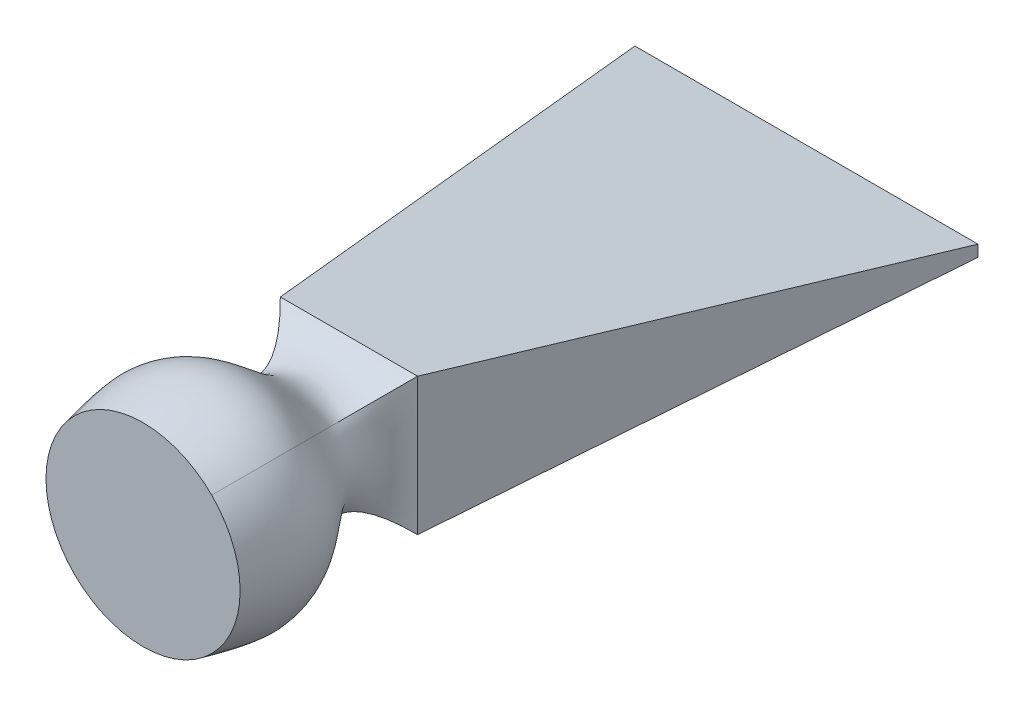
ISO-10303-21;
HEADER;
FILE_DESCRIPTION(('STEP AP214'),'2;1');
FILE_NAME('part.step','',(''),(''),'','','');
FILE_SCHEMA(('AUTOMOTIVE_DESIGN { 1 0 10303 214 1 1 1 1 }'));
ENDSEC;
DATA;
#1=APPLICATION_CONTEXT('core data for automotive mechanical design processes');
#2=APPLICATION_PROTOCOL_DEFINITION('international standard','automotive_design',2000,#1);
#3=PRODUCT_CONTEXT('',#1,'mechanical');
#4=PRODUCT('Part','Part','',(#3));
#5=PRODUCT_RELATED_PRODUCT_CATEGORY('part','',(#4));
#6=PRODUCT_DEFINITION_FORMATION('','',#4);
#7=PRODUCT_DEFINITION_CONTEXT('part definition',#1,'design');
#8=PRODUCT_DEFINITION('design','',#6,#7);
#9=PRODUCT_DEFINITION_SHAPE('','',#8);
#10=(LENGTH_UNIT() NAMED_UNIT(*) SI_UNIT(.MILLI.,.METRE.));
#11=(NAMED_UNIT(*) PLANE_ANGLE_UNIT() SI_UNIT($,.RADIAN.));
#12=(NAMED_UNIT(*) SI_UNIT($,.STERADIAN.) SOLID_ANGLE_UNIT());
#13=UNCERTAINTY_MEASURE_WITH_UNIT(LENGTH_MEASURE(1.E-05),#10,'distance_accuracy_value','');
#14=(GEOMETRIC_REPRESENTATION_CONTEXT(3) GLOBAL_UNCERTAINTY_ASSIGNED_CONTEXT((#13)) GLOBAL_UNIT_ASSIGNED_CONTEXT((#10,
#11,#12)) REPRESENTATION_CONTEXT('',''));
#15=CARTESIAN_POINT('',(0.,0.,0.));
#16=DIRECTION('',(0.,0.,1.));
#17=DIRECTION('',(1.,0.,0.));
#18=AXIS2_PLACEMENT_3D('',#15,#16,#17);
#19=CARTESIAN_POINT('',(0.,0.,90.));
#20=DIRECTION('',(0.,0.,1.));
#21=DIRECTION('',(1.,0.,0.));
#22=AXIS2_PLACEMENT_3D('',#19,#20,#21);
#23=PLANE('',#22);
#24=CARTESIAN_POINT('',(0.,0.,90.));
#25=DIRECTION('',(0.,0.,1.));
#26=DIRECTION('',(1.,0.,0.));
#27=AXIS2_PLACEMENT_3D('',#24,#25,#26);
#28=CIRCLE('',#27,42.4264068711928);
#29=CARTESIAN_POINT('',(-30.,30.,90.));
#30=VERTEX_POINT('',#29);
#31=CARTESIAN_POINT('',(-30.,-30.,90.));
#32=VERTEX_POINT('',#31);
#33=EDGE_CURVE('E12',#30,#32,#28,.T.);
#34=ORIENTED_EDGE('',*,*,#33,.T.);
#35=CARTESIAN_POINT('',(30.,-30.,90.));
#36=VERTEX_POINT('',#35);
#37=EDGE_CURVE('E91',#32,#36,#28,.T.);
#38=ORIENTED_EDGE('',*,*,#37,.T.);
#39=CARTESIAN_POINT('',(30.,30.,90.));
#40=VERTEX_POINT('',#39);
#41=EDGE_CURVE('E437',#36,#40,#28,.T.);
#42=ORIENTED_EDGE('',*,*,#41,.T.);
#43=EDGE_CURVE('E376',#40,#30,#28,.T.);
#44=ORIENTED_EDGE('',*,*,#43,.T.);
#45=EDGE_LOOP('',(#34,#38,#42,#44));
#46=FACE_BOUND('',#45,.T.);
#47=ADVANCED_FACE('F85',(#46),#23,.T.);
#48=CARTESIAN_POINT('',(-30.,-30.,0.));
#49=CARTESIAN_POINT('',(-21.5118114248613,-21.5118114248613,8.33333333333333));
#50=CARTESIAN_POINT('',(-10.829816914607,-10.829816914607,26.6793114807311));
#51=CARTESIAN_POINT('',(-36.8093660734544,-36.8093660734544,50.9737526603883));
#52=CARTESIAN_POINT('',(-32.4256114599819,-32.4256114599819,75.7164029367123));
#53=CARTESIAN_POINT('',(-30.,-30.,90.));
#54=CARTESIAN_POINT('',(-10.,-30.,0.));
#55=CARTESIAN_POINT('',(-6.9884027450108,-21.5118114248613,8.33333333333333));
#56=CARTESIAN_POINT('',(-5.75176294849771,-23.1119802716853,26.6808062151397));
#57=CARTESIAN_POINT('',(-16.2115756696794,-55.057962976394,50.9672478116266));
#58=CARTESIAN_POINT('',(-14.299778198001,-48.986669058954,75.7348186902476));
#59=CARTESIAN_POINT('',(-13.442549702307,-46.557450297693,90.));
#60=CARTESIAN_POINT('',(10.,-30.,0.));
#61=CARTESIAN_POINT('',(7.53500593483973,-21.5118114248613,8.33333333333333));
#62=CARTESIAN_POINT('',(6.98706289419131,-23.1122730621668,26.6823009495483));
#63=CARTESIAN_POINT('',(15.7695051189354,-55.0566887983261,50.9607429628648));
#64=CARTESIAN_POINT('',(14.1537041709008,-48.9902763602331,75.753234443783));
#65=CARTESIAN_POINT('',(13.442549702307,-46.557450297693,90.));
#66=CARTESIAN_POINT('',(30.,-30.,0.));
#67=CARTESIAN_POINT('',(22.0584146146903,-21.5118114248613,8.33333333333333));
#68=CARTESIAN_POINT('',(12.0651168603006,-10.8306952860514,26.6837956839569));
#69=CARTESIAN_POINT('',(36.3672955227104,-36.8055435392507,50.9542381141031));
#70=CARTESIAN_POINT('',(32.2795374328817,-32.4364333638192,75.7716501973183));
#71=CARTESIAN_POINT('',(30.,-30.,90.));
#72=B_SPLINE_SURFACE_WITH_KNOTS('',3,3,((#48,#49,#50,#51,#52,#53),(#54,#55,#56,#57,#58,#59),
(#60,#61,#62,#63,#64,#65),(#66,#67,#68,#69,#70,#71)),.UNSPECIFIED.,.F.,.F.,.F.,(4,4),(4,1,1,4),
(0.,1.),(0.,0.284253833180905,0.593781069386952,1.),.UNSPECIFIED.);
#73=DIRECTION('',(1.,0.,0.));
#74=VECTOR('',#73,1.);
#75=CARTESIAN_POINT('',(-30.,-30.,0.));
#76=LINE('',#75,#74);
#77=CARTESIAN_POINT('',(-30.,-30.,0.));
#78=VERTEX_POINT('',#77);
#79=CARTESIAN_POINT('',(30.,-30.,0.));
#80=VERTEX_POINT('',#79);
#81=EDGE_CURVE('E418',#78,#80,#76,.T.);
#82=CARTESIAN_POINT('',(30.,-30.,0.));
#83=CARTESIAN_POINT('',(22.0584146146903,-21.5118114248613,8.33333333333333));
#84=CARTESIAN_POINT('',(12.0651168603006,-10.8306952860514,26.6837956839569));
#85=CARTESIAN_POINT('',(36.3672955227104,-36.8055435392507,50.9542381141031));
#86=CARTESIAN_POINT('',(32.2795374328817,-32.4364333638192,75.7716501973183));
#87=CARTESIAN_POINT('',(30.,-30.,90.));
#88=B_SPLINE_CURVE_WITH_KNOTS('',3,(#82,#83,#84,#85,#86,#87),.UNSPECIFIED.,.F.,.F.,(4,1,1,4),
(0.,0.284253833180905,0.593781069386952,1.),.UNSPECIFIED.);
#89=EDGE_CURVE('E400',#80,#36,#88,.T.);
#90=CARTESIAN_POINT('',(-30.,-30.,0.));
#91=CARTESIAN_POINT('',(-21.5118114248613,-21.5118114248613,8.33333333333333));
#92=CARTESIAN_POINT('',(-10.829816914607,-10.829816914607,26.6793114807311));
#93=CARTESIAN_POINT('',(-36.8093660734544,-36.8093660734544,50.9737526603883));
#94=CARTESIAN_POINT('',(-32.4256114599819,-32.4256114599819,75.7164029367123));
#95=CARTESIAN_POINT('',(-30.,-30.,90.));
#96=B_SPLINE_CURVE_WITH_KNOTS('',3,(#90,#91,#92,#93,#94,#95),.UNSPECIFIED.,.F.,.F.,(4,1,1,4),
(0.,0.284253833180905,0.593781069386952,1.),.UNSPECIFIED.);
#97=EDGE_CURVE('E251',#32,#78,#96,.F.);
#98=ORIENTED_EDGE('',*,*,#81,.T.);
#99=ORIENTED_EDGE('',*,*,#89,.T.);
#100=ORIENTED_EDGE('',*,*,#37,.F.);
#101=ORIENTED_EDGE('',*,*,#97,.T.);
#102=EDGE_LOOP('',(#98,#99,#100,#101));
#103=FACE_BOUND('',#102,.T.);
#104=ADVANCED_FACE('F298',(#103),#72,.T.);
#105=CARTESIAN_POINT('',(30.,-30.,0.));
#106=CARTESIAN_POINT('',(22.0584146146903,-21.5118114248613,8.33333333333333));
#107=CARTESIAN_POINT('',(12.0651168603006,-10.8306952860514,26.6837956839569));
#108=CARTESIAN_POINT('',(36.3672955227104,-36.8055435392507,50.9542381141031));
#109=CARTESIAN_POINT('',(32.2795374328817,-32.4364333638192,75.7716501973183));
#110=CARTESIAN_POINT('',(30.,-30.,90.));
#111=CARTESIAN_POINT('',(30.,-10.,0.));
#112=CARTESIAN_POINT('',(22.0584146146903,-6.9884027450108,8.33333333333333));
#113=CARTESIAN_POINT('',(24.3472638182131,-5.75207213814497,26.6853038157003));
#114=CARTESIAN_POINT('',(54.6159637922371,-16.2102301250244,50.9476749622502));
#115=CARTESIAN_POINT('',(48.8403929872674,-14.3035875438666,75.7902310116253));
#116=CARTESIAN_POINT('',(46.557450297693,-13.442549702307,90.));
#117=CARTESIAN_POINT('',(30.,10.,0.));
#118=CARTESIAN_POINT('',(22.0584146146903,7.53500593483973,8.33333333333333));
#119=CARTESIAN_POINT('',(24.3475402095288,6.98732288634118,26.6868119474437));
#120=CARTESIAN_POINT('',(54.6147609807563,15.7683736740416,50.9411118103973));
#121=CARTESIAN_POINT('',(48.84379824396,14.156907383007,75.8088118259324));
#122=CARTESIAN_POINT('',(46.557450297693,13.442549702307,90.));
#123=CARTESIAN_POINT('',(30.,30.,0.));
#124=CARTESIAN_POINT('',(22.0584146146903,22.0584146146903,8.33333333333333));
#125=CARTESIAN_POINT('',(12.0659460342476,12.0659460342476,26.688320079187));
#126=CARTESIAN_POINT('',(36.3636870882679,36.3636870882679,50.9345486585445));
#127=CARTESIAN_POINT('',(32.2897532029597,32.2897532029596,75.8273926402394));
#128=CARTESIAN_POINT('',(30.,30.,90.));
#129=B_SPLINE_SURFACE_WITH_KNOTS('',3,3,((#105,#106,#107,#108,#109,#110),(#111,#112,#113,#114,
#115,#116),(#117,#118,#119,#120,#121,#122),(#123,#124,#125,#126,#127,#128)),.UNSPECIFIED.,.F.,
.F.,.F.,(4,4),(4,1,1,4),(0.,1.),(0.,0.284253833180905,0.593781069386952,1.),.UNSPECIFIED.);
#130=DIRECTION('',(0.,1.,0.));
#131=VECTOR('',#130,1.);
#132=CARTESIAN_POINT('',(30.,-30.,0.));
#133=LINE('',#132,#131);
#134=CARTESIAN_POINT('',(30.,30.,0.));
#135=VERTEX_POINT('',#134);
#136=EDGE_CURVE('E174',#80,#135,#133,.T.);
#137=CARTESIAN_POINT('',(30.,30.,0.));
#138=CARTESIAN_POINT('',(22.0584146146903,22.0584146146903,8.33333333333333));
#139=CARTESIAN_POINT('',(12.0659460342476,12.0659460342476,26.688320079187));
#140=CARTESIAN_POINT('',(36.3636870882679,36.3636870882679,50.9345486585445));
#141=CARTESIAN_POINT('',(32.2897532029597,32.2897532029596,75.8273926402394));
#142=CARTESIAN_POINT('',(30.,30.,90.));
#143=B_SPLINE_CURVE_WITH_KNOTS('',3,(#137,#138,#139,#140,#141,#142),.UNSPECIFIED.,.F.,.F.,(4,1,
1,4),(0.,0.284253833180905,0.593781069386952,1.),.UNSPECIFIED.);
#144=EDGE_CURVE('E389',#135,#40,#143,.T.);
#145=ORIENTED_EDGE('',*,*,#136,.T.);
#146=ORIENTED_EDGE('',*,*,#144,.T.);
#147=ORIENTED_EDGE('',*,*,#41,.F.);
#148=ORIENTED_EDGE('',*,*,#89,.F.);
#149=EDGE_LOOP('',(#145,#146,#147,#148));
#150=FACE_BOUND('',#149,.T.);
#151=ADVANCED_FACE('F301',(#150),#129,.T.);
#152=CARTESIAN_POINT('',(-30.,30.,0.));
#153=CARTESIAN_POINT('',(-21.5118114248613,22.0584146146903,8.33333333333334));
#154=CARTESIAN_POINT('',(-10.8306952860514,12.0651168603006,26.6837956839569));
#155=CARTESIAN_POINT('',(-36.8055435392507,36.3672955227104,50.9542381141031));
#156=CARTESIAN_POINT('',(-32.4364333638192,32.2795374328817,75.7716501973183));
#157=CARTESIAN_POINT('',(-30.,30.,90.));
#158=CARTESIAN_POINT('',(-30.,10.,0.));
#159=CARTESIAN_POINT('',(-21.5118114248613,7.53500593483973,8.33333333333334));
#160=CARTESIAN_POINT('',(-23.1122730621668,6.98706289419132,26.6823009495483));
#161=CARTESIAN_POINT('',(-55.0566887983261,15.7695051189354,50.9607429628648));
#162=CARTESIAN_POINT('',(-48.9902763602331,14.1537041709009,75.753234443783));
#163=CARTESIAN_POINT('',(-46.557450297693,13.442549702307,90.));
#164=CARTESIAN_POINT('',(-30.,-10.,0.));
#165=CARTESIAN_POINT('',(-21.5118114248613,-6.9884027450108,8.33333333333334));
#166=CARTESIAN_POINT('',(-23.1119802716853,-5.7517629484977,26.6808062151397));
#167=CARTESIAN_POINT('',(-55.057962976394,-16.2115756696794,50.9672478116266));
#168=CARTESIAN_POINT('',(-48.986669058954,-14.299778198001,75.7348186902476));
#169=CARTESIAN_POINT('',(-46.557450297693,-13.442549702307,90.));
#170=CARTESIAN_POINT('',(-30.,-30.,0.));
#171=CARTESIAN_POINT('',(-21.5118114248613,-21.5118114248613,8.33333333333334));
#172=CARTESIAN_POINT('',(-10.829816914607,-10.829816914607,26.6793114807311));
#173=CARTESIAN_POINT('',(-36.8093660734544,-36.8093660734544,50.9737526603883));
#174=CARTESIAN_POINT('',(-32.4256114599819,-32.4256114599819,75.7164029367123));
#175=CARTESIAN_POINT('',(-30.,-30.,90.));
#176=B_SPLINE_SURFACE_WITH_KNOTS('',3,3,((#152,#153,#154,#155,#156,#157),(#158,#159,#160,#161,
#162,#163),(#164,#165,#166,#167,#168,#169),(#170,#171,#172,#173,#174,#175)),.UNSPECIFIED.,.F.,
.F.,.F.,(4,4),(4,1,1,4),(0.,1.),(0.,0.284253833180905,0.593781069386952,1.),.UNSPECIFIED.);
#177=DIRECTION('',(0.,-1.,0.));
#178=VECTOR('',#177,1.);
#179=CARTESIAN_POINT('',(-30.,-30.,0.));
#180=LINE('',#179,#178);
#181=CARTESIAN_POINT('',(-30.,30.,0.));
#182=VERTEX_POINT('',#181);
#183=EDGE_CURVE('E172',#182,#78,#180,.T.);
#184=CARTESIAN_POINT('',(-30.,30.,0.));
#185=CARTESIAN_POINT('',(-21.5118114248613,22.0584146146903,8.33333333333334));
#186=CARTESIAN_POINT('',(-10.8306952860514,12.0651168603006,26.6837956839569));
#187=CARTESIAN_POINT('',(-36.8055435392507,36.3672955227104,50.9542381141031));
#188=CARTESIAN_POINT('',(-32.4364333638192,32.2795374328817,75.7716501973183));
#189=CARTESIAN_POINT('',(-30.,30.,90.));
#190=B_SPLINE_CURVE_WITH_KNOTS('',3,(#184,#185,#186,#187,#188,#189),.UNSPECIFIED.,.F.,.F.,(4,1,
1,4),(0.,0.284253833180905,0.593781069386952,1.),.UNSPECIFIED.);
#191=EDGE_CURVE('E385',#182,#30,#190,.T.);
#192=ORIENTED_EDGE('',*,*,#183,.T.);
#193=ORIENTED_EDGE('',*,*,#97,.F.);
#194=ORIENTED_EDGE('',*,*,#33,.F.);
#195=ORIENTED_EDGE('',*,*,#191,.F.);
#196=EDGE_LOOP('',(#192,#193,#194,#195));
#197=FACE_BOUND('',#196,.T.);
#198=ADVANCED_FACE('F300',(#197),#176,.T.);
#199=CARTESIAN_POINT('',(30.,30.,0.));
#200=CARTESIAN_POINT('',(22.0584146146903,22.0584146146903,8.33333333333334));
#201=CARTESIAN_POINT('',(12.0659460342476,12.0659460342476,26.688320079187));
#202=CARTESIAN_POINT('',(36.3636870882679,36.3636870882679,50.9345486585445));
#203=CARTESIAN_POINT('',(32.2897532029597,32.2897532029597,75.8273926402394));
#204=CARTESIAN_POINT('',(30.,30.,90.));
#205=CARTESIAN_POINT('',(10.,30.,0.));
#206=CARTESIAN_POINT('',(7.53500593483973,22.0584146146903,8.33333333333334));
#207=CARTESIAN_POINT('',(6.98732288634119,24.3475402095288,26.6868119474437));
#208=CARTESIAN_POINT('',(15.7683736740416,54.6147609807563,50.9411118103973));
#209=CARTESIAN_POINT('',(14.156907383007,48.84379824396,75.8088118259324));
#210=CARTESIAN_POINT('',(13.442549702307,46.557450297693,90.));
#211=CARTESIAN_POINT('',(-10.,30.,0.));
#212=CARTESIAN_POINT('',(-6.9884027450108,22.0584146146903,8.33333333333334));
#213=CARTESIAN_POINT('',(-5.75207213814497,24.3472638182131,26.6853038157003));
#214=CARTESIAN_POINT('',(-16.2102301250244,54.6159637922371,50.9476749622502));
#215=CARTESIAN_POINT('',(-14.3035875438666,48.8403929872674,75.7902310116253));
#216=CARTESIAN_POINT('',(-13.442549702307,46.557450297693,90.));
#217=CARTESIAN_POINT('',(-30.,30.,0.));
#218=CARTESIAN_POINT('',(-21.5118114248613,22.0584146146903,8.33333333333334));
#219=CARTESIAN_POINT('',(-10.8306952860514,12.0651168603006,26.6837956839569));
#220=CARTESIAN_POINT('',(-36.8055435392507,36.3672955227104,50.9542381141031));
#221=CARTESIAN_POINT('',(-32.4364333638192,32.2795374328817,75.7716501973183));
#222=CARTESIAN_POINT('',(-30.,30.,90.));
#223=B_SPLINE_SURFACE_WITH_KNOTS('',3,3,((#199,#200,#201,#202,#203,#204),(#205,#206,#207,#208,
#209,#210),(#211,#212,#213,#214,#215,#216),(#217,#218,#219,#220,#221,#222)),.UNSPECIFIED.,.F.,
.F.,.F.,(4,4),(4,1,1,4),(0.,1.),(0.,0.284253833180905,0.593781069386952,1.),.UNSPECIFIED.);
#224=DIRECTION('',(-1.,0.,0.));
#225=VECTOR('',#224,1.);
#226=CARTESIAN_POINT('',(-30.,30.,0.));
#227=LINE('',#226,#225);
#228=EDGE_CURVE('E180',#135,#182,#227,.T.);
#229=ORIENTED_EDGE('',*,*,#228,.T.);
#230=ORIENTED_EDGE('',*,*,#191,.T.);
#231=ORIENTED_EDGE('',*,*,#43,.F.);
#232=ORIENTED_EDGE('',*,*,#144,.F.);
#233=EDGE_LOOP('',(#229,#230,#231,#232));
#234=FACE_BOUND('',#233,.T.);
#235=ADVANCED_FACE('F265',(#234),#223,.T.);
#236=CARTESIAN_POINT('',(0.,0.,-200.));
#237=DIRECTION('',(0.,0.,-1.));
#238=DIRECTION('',(-1.,0.,0.));
#239=AXIS2_PLACEMENT_3D('',#236,#237,#238);
#240=PLANE('',#239);
#241=DIRECTION('',(0.,1.,0.));
#242=VECTOR('',#241,1.);
#243=CARTESIAN_POINT('',(75.,-2.5,-200.));
#244=LINE('',#243,#242);
#245=CARTESIAN_POINT('',(75.,-2.5,-200.));
#246=VERTEX_POINT('',#245);
#247=CARTESIAN_POINT('',(75.,2.5,-200.));
#248=VERTEX_POINT('',#247);
#249=EDGE_CURVE('E164',#246,#248,#244,.T.);
#250=ORIENTED_EDGE('',*,*,#249,.F.);
#251=DIRECTION('',(1.,0.,0.));
#252=VECTOR('',#251,1.);
#253=CARTESIAN_POINT('',(-75.,-2.5,-200.));
#254=LINE('',#253,#252);
#255=CARTESIAN_POINT('',(-75.,-2.5,-200.));
#256=VERTEX_POINT('',#255);
#257=EDGE_CURVE('E144',#256,#246,#254,.T.);
#258=ORIENTED_EDGE('',*,*,#257,.F.);
#259=DIRECTION('',(0.,-1.,0.));
#260=VECTOR('',#259,1.);
#261=CARTESIAN_POINT('',(-75.,-2.5,-200.));
#262=LINE('',#261,#260);
#263=CARTESIAN_POINT('',(-75.,2.5,-200.));
#264=VERTEX_POINT('',#263);
#265=EDGE_CURVE('E137',#264,#256,#262,.T.);
#266=ORIENTED_EDGE('',*,*,#265,.F.);
#267=DIRECTION('',(-1.,0.,0.));
#268=VECTOR('',#267,1.);
#269=CARTESIAN_POINT('',(-75.,2.5,-200.));
#270=LINE('',#269,#268);
#271=EDGE_CURVE('E143',#248,#264,#270,.T.);
#272=ORIENTED_EDGE('',*,*,#271,.F.);
#273=EDGE_LOOP('',(#250,#258,#266,#272));
#274=FACE_BOUND('',#273,.T.);
#275=ADVANCED_FACE('F138',(#274),#240,.T.);
#276=CARTESIAN_POINT('',(0.,-29.4433369115166,-4.04845882533354));
#277=DIRECTION('',(0.,0.990678839845296,0.136218340478728));
#278=DIRECTION('',(0.,-0.136218340478728,0.990678839845296));
#279=AXIS2_PLACEMENT_3D('',#276,#277,#278);
#280=PLANE('',#279);
#281=DIRECTION('',(-0.217563370783763,-0.132955393256744,0.966948314594504));
#282=VECTOR('',#281,1.);
#283=CARTESIAN_POINT('',(75.,-2.5,-200.));
#284=LINE('',#283,#282);
#285=EDGE_CURVE('E223',#246,#80,#284,.T.);
#286=ORIENTED_EDGE('',*,*,#285,.T.);
#287=ORIENTED_EDGE('',*,*,#81,.F.);
#288=DIRECTION('',(0.217563370783763,-0.132955393256744,0.966948314594504));
#289=VECTOR('',#288,1.);
#290=CARTESIAN_POINT('',(-75.,-2.5,-200.));
#291=LINE('',#290,#289);
#292=EDGE_CURVE('E178',#256,#78,#291,.T.);
#293=ORIENTED_EDGE('',*,*,#292,.F.);
#294=ORIENTED_EDGE('',*,*,#257,.T.);
#295=EDGE_LOOP('',(#286,#287,#293,#294));
#296=FACE_BOUND('',#295,.T.);
#297=ADVANCED_FACE('F204',(#296),#280,.F.);
#298=CARTESIAN_POINT('',(-28.5544318857823,0.,6.42474717430101));
#299=DIRECTION('',(0.975609756097561,0.,-0.219512195121951));
#300=DIRECTION('',(-0.219512195121951,0.,-0.975609756097561));
#301=AXIS2_PLACEMENT_3D('',#298,#299,#300);
#302=PLANE('',#301);
#303=ORIENTED_EDGE('',*,*,#292,.T.);
#304=ORIENTED_EDGE('',*,*,#183,.F.);
#305=DIRECTION('',(0.217563370783763,0.132955393256744,0.966948314594504));
#306=VECTOR('',#305,1.);
#307=CARTESIAN_POINT('',(-75.,2.5,-200.));
#308=LINE('',#307,#306);
#309=EDGE_CURVE('E159',#264,#182,#308,.T.);
#310=ORIENTED_EDGE('',*,*,#309,.F.);
#311=ORIENTED_EDGE('',*,*,#265,.T.);
#312=EDGE_LOOP('',(#303,#304,#310,#311));
#313=FACE_BOUND('',#312,.T.);
#314=ADVANCED_FACE('F166',(#313),#302,.F.);
#315=CARTESIAN_POINT('',(28.5544318857823,0.,6.42474717430101));
#316=DIRECTION('',(-0.975609756097561,0.,-0.219512195121951));
#317=DIRECTION('',(-0.219512195121951,0.,0.975609756097561));
#318=AXIS2_PLACEMENT_3D('',#315,#316,#317);
#319=PLANE('',#318);
#320=DIRECTION('',(-0.217563370783763,0.132955393256744,0.966948314594504));
#321=VECTOR('',#320,1.);
#322=CARTESIAN_POINT('',(75.,2.5,-200.));
#323=LINE('',#322,#321);
#324=EDGE_CURVE('E162',#248,#135,#323,.T.);
#325=ORIENTED_EDGE('',*,*,#324,.T.);
#326=ORIENTED_EDGE('',*,*,#136,.F.);
#327=ORIENTED_EDGE('',*,*,#285,.F.);
#328=ORIENTED_EDGE('',*,*,#249,.T.);
#329=EDGE_LOOP('',(#325,#326,#327,#328));
#330=FACE_BOUND('',#329,.T.);
#331=ADVANCED_FACE('F201',(#330),#319,.F.);
#332=CARTESIAN_POINT('',(0.,29.4433369115166,-4.04845882533354));
#333=DIRECTION('',(0.,-0.990678839845296,0.136218340478728));
#334=DIRECTION('',(0.,-0.136218340478728,-0.990678839845296));
#335=AXIS2_PLACEMENT_3D('',#332,#333,#334);
#336=PLANE('',#335);
#337=ORIENTED_EDGE('',*,*,#309,.T.);
#338=ORIENTED_EDGE('',*,*,#228,.F.);
#339=ORIENTED_EDGE('',*,*,#324,.F.);
#340=ORIENTED_EDGE('',*,*,#271,.T.);
#341=EDGE_LOOP('',(#337,#338,#339,#340));
#342=FACE_BOUND('',#341,.T.);
#343=ADVANCED_FACE('F157',(#342),#336,.F.);
#344=CLOSED_SHELL('',(#47,#104,#151,#198,#235,#275,#297,#314,#331,#343));
#345=MANIFOLD_SOLID_BREP('B2',#344);
#346=ADVANCED_BREP_SHAPE_REPRESENTATION('',(#18,#345),#14);
#347=SHAPE_DEFINITION_REPRESENTATION(#9,#346);
ENDSEC;
END-ISO-10303-21;
